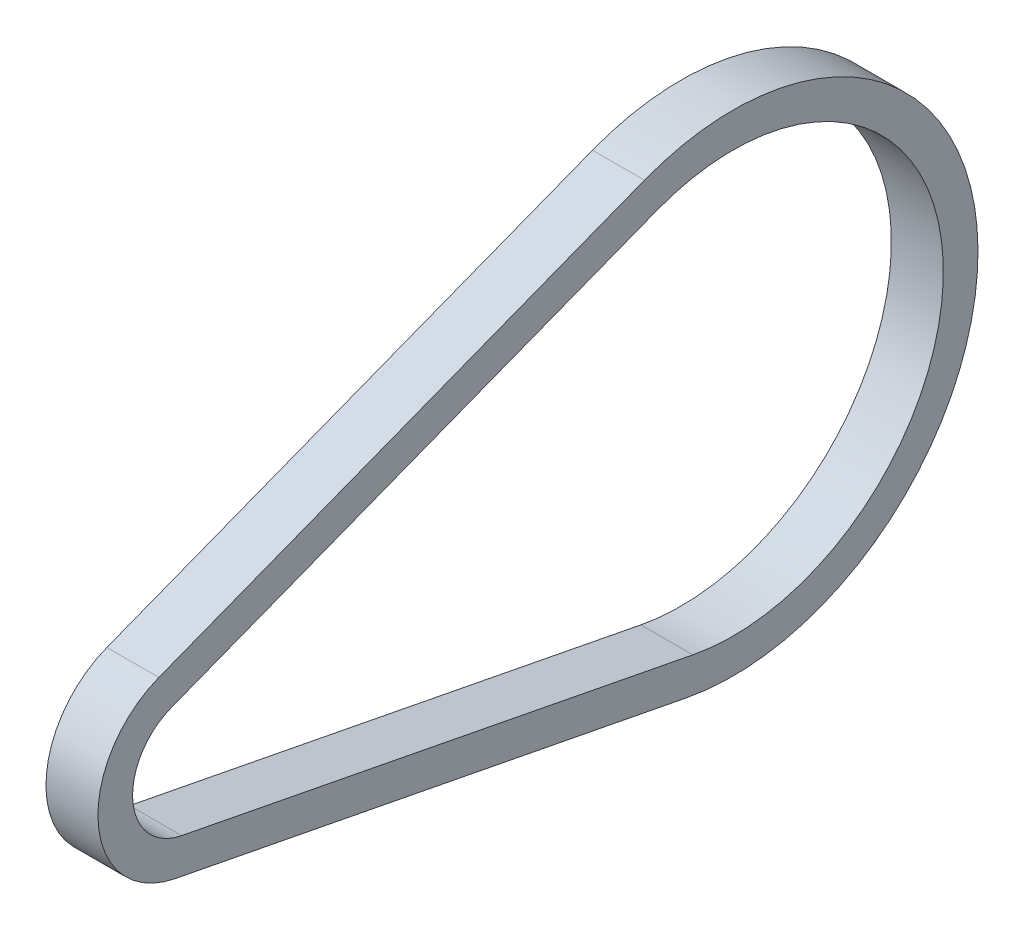
ISO-10303-21;
HEADER;
FILE_DESCRIPTION(('STEP AP214'),'2;1');
FILE_NAME('part.step','',(''),(''),'','','');
FILE_SCHEMA(('AUTOMOTIVE_DESIGN { 1 0 10303 214 1 1 1 1 }'));
ENDSEC;
DATA;
#1=APPLICATION_CONTEXT('core data for automotive mechanical design processes');
#2=APPLICATION_PROTOCOL_DEFINITION('international standard','automotive_design',2000,#1);
#3=PRODUCT_CONTEXT('',#1,'mechanical');
#4=PRODUCT('Part','Part','',(#3));
#5=PRODUCT_RELATED_PRODUCT_CATEGORY('part','',(#4));
#6=PRODUCT_DEFINITION_FORMATION('','',#4);
#7=PRODUCT_DEFINITION_CONTEXT('part definition',#1,'design');
#8=PRODUCT_DEFINITION('design','',#6,#7);
#9=PRODUCT_DEFINITION_SHAPE('','',#8);
#10=(LENGTH_UNIT() NAMED_UNIT(*) SI_UNIT(.MILLI.,.METRE.));
#11=(NAMED_UNIT(*) PLANE_ANGLE_UNIT() SI_UNIT($,.RADIAN.));
#12=(NAMED_UNIT(*) SI_UNIT($,.STERADIAN.) SOLID_ANGLE_UNIT());
#13=UNCERTAINTY_MEASURE_WITH_UNIT(LENGTH_MEASURE(1.E-05),#10,'distance_accuracy_value','');
#14=(GEOMETRIC_REPRESENTATION_CONTEXT(3) GLOBAL_UNCERTAINTY_ASSIGNED_CONTEXT((#13)) GLOBAL_UNIT_ASSIGNED_CONTEXT((#10,
#11,#12)) REPRESENTATION_CONTEXT('',''));
#15=CARTESIAN_POINT('',(0.,0.,0.));
#16=DIRECTION('',(0.,0.,1.));
#17=DIRECTION('',(1.,0.,0.));
#18=AXIS2_PLACEMENT_3D('',#15,#16,#17);
#19=CARTESIAN_POINT('',(119.775,220.816574262264,-819.81973874723));
#20=DIRECTION('',(1.,0.,0.));
#21=DIRECTION('',(0.,0.,-1.));
#22=AXIS2_PLACEMENT_3D('',#19,#20,#21);
#23=PLANE('',#22);
#24=CARTESIAN_POINT('',(119.775,220.816574262264,-819.81973874723));
#25=DIRECTION('',(1.,0.,0.));
#26=DIRECTION('',(0.,0.,-1.));
#27=AXIS2_PLACEMENT_3D('',#24,#25,#26);
#28=CIRCLE('',#27,89.8533704758752);
#29=CARTESIAN_POINT('',(119.775,132.604166692395,-802.725899605535));
#30=VERTEX_POINT('',#29);
#31=CARTESIAN_POINT('',(119.775,304.620260152817,-787.407234724362));
#32=VERTEX_POINT('',#31);
#33=EDGE_CURVE('E164',#30,#32,#28,.T.);
#34=ORIENTED_EDGE('',*,*,#33,.T.);
#35=DIRECTION('',(0.,-0.360726635530837,0.932671589799219));
#36=VECTOR('',#35,1.);
#37=CARTESIAN_POINT('',(119.775,304.620260152817,-787.407234724362));
#38=LINE('',#37,#36);
#39=CARTESIAN_POINT('',(119.775,235.773555273738,-609.401622254085));
#40=VERTEX_POINT('',#39);
#41=EDGE_CURVE('E167',#32,#40,#38,.T.);
#42=ORIENTED_EDGE('',*,*,#41,.T.);
#43=CARTESIAN_POINT('',(119.775,203.2,-622.));
#44=DIRECTION('',(1.,0.,0.));
#45=DIRECTION('',(0.,0.,-1.));
#46=AXIS2_PLACEMENT_3D('',#43,#44,#45);
#47=CIRCLE('',#46,34.925);
#48=CARTESIAN_POINT('',(119.775,168.912823925677,-615.355815938101));
#49=VERTEX_POINT('',#48);
#50=EDGE_CURVE('E170',#40,#49,#47,.T.);
#51=ORIENTED_EDGE('',*,*,#50,.T.);
#52=DIRECTION('',(0.,-0.190241490677126,-0.981737324962714));
#53=VECTOR('',#52,1.);
#54=CARTESIAN_POINT('',(119.775,168.912823925677,-615.355815938101));
#55=LINE('',#54,#53);
#56=EDGE_CURVE('E172',#49,#30,#55,.T.);
#57=ORIENTED_EDGE('',*,*,#56,.T.);
#58=EDGE_LOOP('',(#34,#42,#51,#57));
#59=FACE_BOUND('',#58,.T.);
#60=DIRECTION('',(0.,-0.360726635530837,0.932671589799219));
#61=VECTOR('',#60,1.);
#62=CARTESIAN_POINT('',(119.775,292.775330962367,-791.988462995603));
#63=LINE('',#62,#61);
#64=CARTESIAN_POINT('',(119.775,292.775330962367,-791.988462995603));
#65=VERTEX_POINT('',#64);
#66=CARTESIAN_POINT('',(119.775,223.928626083288,-613.982850525327));
#67=VERTEX_POINT('',#66);
#68=EDGE_CURVE('E136',#65,#67,#63,.T.);
#69=ORIENTED_EDGE('',*,*,#68,.F.);
#70=CARTESIAN_POINT('',(119.775,220.816574262264,-819.81973874723));
#71=DIRECTION('',(1.,0.,0.));
#72=DIRECTION('',(0.,0.,-1.));
#73=AXIS2_PLACEMENT_3D('',#70,#71,#72);
#74=CIRCLE('',#73,77.1533704758752);
#75=CARTESIAN_POINT('',(119.775,145.072230719421,-805.141966537135));
#76=VERTEX_POINT('',#75);
#77=EDGE_CURVE('E128',#76,#65,#74,.T.);
#78=ORIENTED_EDGE('',*,*,#77,.F.);
#79=DIRECTION('',(0.,-0.190241490677126,-0.981737324962714));
#80=VECTOR('',#79,1.);
#81=CARTESIAN_POINT('',(119.775,181.380887952704,-617.771882869701));
#82=LINE('',#81,#80);
#83=CARTESIAN_POINT('',(119.775,181.380887952704,-617.771882869701));
#84=VERTEX_POINT('',#83);
#85=EDGE_CURVE('E150',#84,#76,#82,.T.);
#86=ORIENTED_EDGE('',*,*,#85,.F.);
#87=CARTESIAN_POINT('',(119.775,203.2,-622.));
#88=DIRECTION('',(1.,0.,0.));
#89=DIRECTION('',(0.,0.,-1.));
#90=AXIS2_PLACEMENT_3D('',#87,#88,#89);
#91=CIRCLE('',#90,22.225);
#92=EDGE_CURVE('E148',#67,#84,#91,.T.);
#93=ORIENTED_EDGE('',*,*,#92,.F.);
#94=EDGE_LOOP('',(#69,#78,#86,#93));
#95=FACE_BOUND('',#94,.T.);
#96=ADVANCED_FACE('F63',(#59,#95),#23,.T.);
#97=CARTESIAN_POINT('',(100.725,220.816574262264,-819.81973874723));
#98=DIRECTION('',(1.,0.,0.));
#99=DIRECTION('',(0.,0.,-1.));
#100=AXIS2_PLACEMENT_3D('',#97,#98,#99);
#101=PLANE('',#100);
#102=CARTESIAN_POINT('',(100.725,220.816574262264,-819.81973874723));
#103=DIRECTION('',(1.,0.,0.));
#104=DIRECTION('',(0.,0.,-1.));
#105=AXIS2_PLACEMENT_3D('',#102,#103,#104);
#106=CIRCLE('',#105,89.8533704758752);
#107=CARTESIAN_POINT('',(100.725,132.604166692395,-802.725899605535));
#108=VERTEX_POINT('',#107);
#109=CARTESIAN_POINT('',(100.725,304.620260152817,-787.407234724362));
#110=VERTEX_POINT('',#109);
#111=EDGE_CURVE('E144',#108,#110,#106,.T.);
#112=ORIENTED_EDGE('',*,*,#111,.F.);
#113=DIRECTION('',(0.,-0.190241490677126,-0.981737324962714));
#114=VECTOR('',#113,1.);
#115=CARTESIAN_POINT('',(100.725,168.912823925677,-615.355815938101));
#116=LINE('',#115,#114);
#117=CARTESIAN_POINT('',(100.725,168.912823925677,-615.355815938101));
#118=VERTEX_POINT('',#117);
#119=EDGE_CURVE('E168',#118,#108,#116,.T.);
#120=ORIENTED_EDGE('',*,*,#119,.F.);
#121=CARTESIAN_POINT('',(100.725,203.2,-622.));
#122=DIRECTION('',(1.,0.,0.));
#123=DIRECTION('',(0.,0.,-1.));
#124=AXIS2_PLACEMENT_3D('',#121,#122,#123);
#125=CIRCLE('',#124,34.925);
#126=CARTESIAN_POINT('',(100.725,235.773555273738,-609.401622254085));
#127=VERTEX_POINT('',#126);
#128=EDGE_CURVE('E179',#127,#118,#125,.T.);
#129=ORIENTED_EDGE('',*,*,#128,.F.);
#130=DIRECTION('',(0.,-0.360726635530837,0.932671589799219));
#131=VECTOR('',#130,1.);
#132=CARTESIAN_POINT('',(100.725,304.620260152817,-787.407234724362));
#133=LINE('',#132,#131);
#134=EDGE_CURVE('E177',#110,#127,#133,.T.);
#135=ORIENTED_EDGE('',*,*,#134,.F.);
#136=EDGE_LOOP('',(#112,#120,#129,#135));
#137=FACE_BOUND('',#136,.T.);
#138=CARTESIAN_POINT('',(100.725,220.816574262264,-819.81973874723));
#139=DIRECTION('',(1.,0.,0.));
#140=DIRECTION('',(0.,0.,-1.));
#141=AXIS2_PLACEMENT_3D('',#138,#139,#140);
#142=CIRCLE('',#141,77.1533704758752);
#143=CARTESIAN_POINT('',(100.725,145.072230719421,-805.141966537135));
#144=VERTEX_POINT('',#143);
#145=CARTESIAN_POINT('',(100.725,292.775330962367,-791.988462995603));
#146=VERTEX_POINT('',#145);
#147=EDGE_CURVE('E86',#144,#146,#142,.T.);
#148=ORIENTED_EDGE('',*,*,#147,.T.);
#149=DIRECTION('',(0.,-0.360726635530837,0.932671589799219));
#150=VECTOR('',#149,1.);
#151=CARTESIAN_POINT('',(100.725,292.775330962367,-791.988462995603));
#152=LINE('',#151,#150);
#153=CARTESIAN_POINT('',(100.725,223.928626083288,-613.982850525327));
#154=VERTEX_POINT('',#153);
#155=EDGE_CURVE('E143',#146,#154,#152,.T.);
#156=ORIENTED_EDGE('',*,*,#155,.T.);
#157=CARTESIAN_POINT('',(100.725,203.2,-622.));
#158=DIRECTION('',(1.,0.,0.));
#159=DIRECTION('',(0.,0.,-1.));
#160=AXIS2_PLACEMENT_3D('',#157,#158,#159);
#161=CIRCLE('',#160,22.225);
#162=CARTESIAN_POINT('',(100.725,181.380887952704,-617.771882869701));
#163=VERTEX_POINT('',#162);
#164=EDGE_CURVE('E156',#154,#163,#161,.T.);
#165=ORIENTED_EDGE('',*,*,#164,.T.);
#166=DIRECTION('',(0.,-0.190241490677126,-0.981737324962714));
#167=VECTOR('',#166,1.);
#168=CARTESIAN_POINT('',(100.725,181.380887952704,-617.771882869701));
#169=LINE('',#168,#167);
#170=EDGE_CURVE('E137',#163,#144,#169,.T.);
#171=ORIENTED_EDGE('',*,*,#170,.T.);
#172=EDGE_LOOP('',(#148,#156,#165,#171));
#173=FACE_BOUND('',#172,.T.);
#174=ADVANCED_FACE('F197',(#137,#173),#101,.F.);
#175=CARTESIAN_POINT('',(119.775,220.816574262264,-819.81973874723));
#176=DIRECTION('',(-1.,0.,0.));
#177=DIRECTION('',(0.,0.,1.));
#178=AXIS2_PLACEMENT_3D('',#175,#176,#177);
#179=CYLINDRICAL_SURFACE('',#178,89.8533704758752);
#180=ORIENTED_EDGE('',*,*,#111,.T.);
#181=DIRECTION('',(-1.,0.,0.));
#182=VECTOR('',#181,1.);
#183=CARTESIAN_POINT('',(119.775,304.620260152817,-787.407234724362));
#184=LINE('',#183,#182);
#185=EDGE_CURVE('E12',#32,#110,#184,.T.);
#186=ORIENTED_EDGE('',*,*,#185,.F.);
#187=ORIENTED_EDGE('',*,*,#33,.F.);
#188=DIRECTION('',(-1.,0.,0.));
#189=VECTOR('',#188,1.);
#190=CARTESIAN_POINT('',(119.775,132.604166692395,-802.725899605535));
#191=LINE('',#190,#189);
#192=EDGE_CURVE('E174',#30,#108,#191,.T.);
#193=ORIENTED_EDGE('',*,*,#192,.T.);
#194=EDGE_LOOP('',(#180,#186,#187,#193));
#195=FACE_BOUND('',#194,.T.);
#196=ADVANCED_FACE('F65',(#195),#179,.T.);
#197=CARTESIAN_POINT('',(119.775,304.620260152817,-787.407234724362));
#198=DIRECTION('',(0.,-0.932671589799219,-0.360726635530837));
#199=DIRECTION('',(0.,0.360726635530837,-0.932671589799219));
#200=AXIS2_PLACEMENT_3D('',#197,#198,#199);
#201=PLANE('',#200);
#202=ORIENTED_EDGE('',*,*,#134,.T.);
#203=DIRECTION('',(-1.,0.,0.));
#204=VECTOR('',#203,1.);
#205=CARTESIAN_POINT('',(119.775,235.773555273738,-609.401622254085));
#206=LINE('',#205,#204);
#207=EDGE_CURVE('E71',#40,#127,#206,.T.);
#208=ORIENTED_EDGE('',*,*,#207,.F.);
#209=ORIENTED_EDGE('',*,*,#41,.F.);
#210=ORIENTED_EDGE('',*,*,#185,.T.);
#211=EDGE_LOOP('',(#202,#208,#209,#210));
#212=FACE_BOUND('',#211,.T.);
#213=ADVANCED_FACE('F207',(#212),#201,.F.);
#214=CARTESIAN_POINT('',(119.775,203.2,-622.));
#215=DIRECTION('',(-1.,0.,0.));
#216=DIRECTION('',(0.,0.,1.));
#217=AXIS2_PLACEMENT_3D('',#214,#215,#216);
#218=CYLINDRICAL_SURFACE('',#217,34.925);
#219=ORIENTED_EDGE('',*,*,#128,.T.);
#220=DIRECTION('',(-1.,0.,0.));
#221=VECTOR('',#220,1.);
#222=CARTESIAN_POINT('',(119.775,168.912823925677,-615.355815938101));
#223=LINE('',#222,#221);
#224=EDGE_CURVE('E184',#49,#118,#223,.T.);
#225=ORIENTED_EDGE('',*,*,#224,.F.);
#226=ORIENTED_EDGE('',*,*,#50,.F.);
#227=ORIENTED_EDGE('',*,*,#207,.T.);
#228=EDGE_LOOP('',(#219,#225,#226,#227));
#229=FACE_BOUND('',#228,.T.);
#230=ADVANCED_FACE('F191',(#229),#218,.T.);
#231=CARTESIAN_POINT('',(119.775,168.912823925677,-615.355815938101));
#232=DIRECTION('',(0.,0.981737324962714,-0.190241490677126));
#233=DIRECTION('',(0.,0.190241490677126,0.981737324962714));
#234=AXIS2_PLACEMENT_3D('',#231,#232,#233);
#235=PLANE('',#234);
#236=ORIENTED_EDGE('',*,*,#119,.T.);
#237=ORIENTED_EDGE('',*,*,#192,.F.);
#238=ORIENTED_EDGE('',*,*,#56,.F.);
#239=ORIENTED_EDGE('',*,*,#224,.T.);
#240=EDGE_LOOP('',(#236,#237,#238,#239));
#241=FACE_BOUND('',#240,.T.);
#242=ADVANCED_FACE('F201',(#241),#235,.F.);
#243=CARTESIAN_POINT('',(119.775,220.816574262264,-819.81973874723));
#244=DIRECTION('',(-1.,0.,0.));
#245=DIRECTION('',(0.,0.,1.));
#246=AXIS2_PLACEMENT_3D('',#243,#244,#245);
#247=CYLINDRICAL_SURFACE('',#246,77.1533704758752);
#248=ORIENTED_EDGE('',*,*,#147,.F.);
#249=DIRECTION('',(-1.,0.,0.));
#250=VECTOR('',#249,1.);
#251=CARTESIAN_POINT('',(119.775,145.072230719421,-805.141966537135));
#252=LINE('',#251,#250);
#253=EDGE_CURVE('E132',#76,#144,#252,.T.);
#254=ORIENTED_EDGE('',*,*,#253,.F.);
#255=ORIENTED_EDGE('',*,*,#77,.T.);
#256=DIRECTION('',(-1.,0.,0.));
#257=VECTOR('',#256,1.);
#258=CARTESIAN_POINT('',(119.775,292.775330962367,-791.988462995603));
#259=LINE('',#258,#257);
#260=EDGE_CURVE('E131',#65,#146,#259,.T.);
#261=ORIENTED_EDGE('',*,*,#260,.T.);
#262=EDGE_LOOP('',(#248,#254,#255,#261));
#263=FACE_BOUND('',#262,.T.);
#264=ADVANCED_FACE('F130',(#263),#247,.F.);
#265=CARTESIAN_POINT('',(119.775,292.775330962367,-791.988462995603));
#266=DIRECTION('',(0.,-0.932671589799219,-0.360726635530837));
#267=DIRECTION('',(0.,0.360726635530837,-0.932671589799219));
#268=AXIS2_PLACEMENT_3D('',#265,#266,#267);
#269=PLANE('',#268);
#270=ORIENTED_EDGE('',*,*,#155,.F.);
#271=ORIENTED_EDGE('',*,*,#260,.F.);
#272=ORIENTED_EDGE('',*,*,#68,.T.);
#273=DIRECTION('',(-1.,0.,0.));
#274=VECTOR('',#273,1.);
#275=CARTESIAN_POINT('',(119.775,223.928626083288,-613.982850525327));
#276=LINE('',#275,#274);
#277=EDGE_CURVE('E145',#67,#154,#276,.T.);
#278=ORIENTED_EDGE('',*,*,#277,.T.);
#279=EDGE_LOOP('',(#270,#271,#272,#278));
#280=FACE_BOUND('',#279,.T.);
#281=ADVANCED_FACE('F140',(#280),#269,.T.);
#282=CARTESIAN_POINT('',(119.775,203.2,-622.));
#283=DIRECTION('',(-1.,0.,0.));
#284=DIRECTION('',(0.,0.,1.));
#285=AXIS2_PLACEMENT_3D('',#282,#283,#284);
#286=CYLINDRICAL_SURFACE('',#285,22.225);
#287=ORIENTED_EDGE('',*,*,#164,.F.);
#288=ORIENTED_EDGE('',*,*,#277,.F.);
#289=ORIENTED_EDGE('',*,*,#92,.T.);
#290=DIRECTION('',(-1.,0.,0.));
#291=VECTOR('',#290,1.);
#292=CARTESIAN_POINT('',(119.775,181.380887952704,-617.771882869701));
#293=LINE('',#292,#291);
#294=EDGE_CURVE('E78',#84,#163,#293,.T.);
#295=ORIENTED_EDGE('',*,*,#294,.T.);
#296=EDGE_LOOP('',(#287,#288,#289,#295));
#297=FACE_BOUND('',#296,.T.);
#298=ADVANCED_FACE('F230',(#297),#286,.F.);
#299=CARTESIAN_POINT('',(119.775,181.380887952704,-617.771882869701));
#300=DIRECTION('',(0.,0.981737324962714,-0.190241490677126));
#301=DIRECTION('',(0.,0.190241490677126,0.981737324962714));
#302=AXIS2_PLACEMENT_3D('',#299,#300,#301);
#303=PLANE('',#302);
#304=ORIENTED_EDGE('',*,*,#170,.F.);
#305=ORIENTED_EDGE('',*,*,#294,.F.);
#306=ORIENTED_EDGE('',*,*,#85,.T.);
#307=ORIENTED_EDGE('',*,*,#253,.T.);
#308=EDGE_LOOP('',(#304,#305,#306,#307));
#309=FACE_BOUND('',#308,.T.);
#310=ADVANCED_FACE('F234',(#309),#303,.T.);
#311=CLOSED_SHELL('',(#96,#174,#196,#213,#230,#242,#264,#281,#298,#310));
#312=MANIFOLD_SOLID_BREP('B2',#311);
#313=ADVANCED_BREP_SHAPE_REPRESENTATION('',(#18,#312),#14);
#314=SHAPE_DEFINITION_REPRESENTATION(#9,#313);
ENDSEC;
END-ISO-10303-21;
